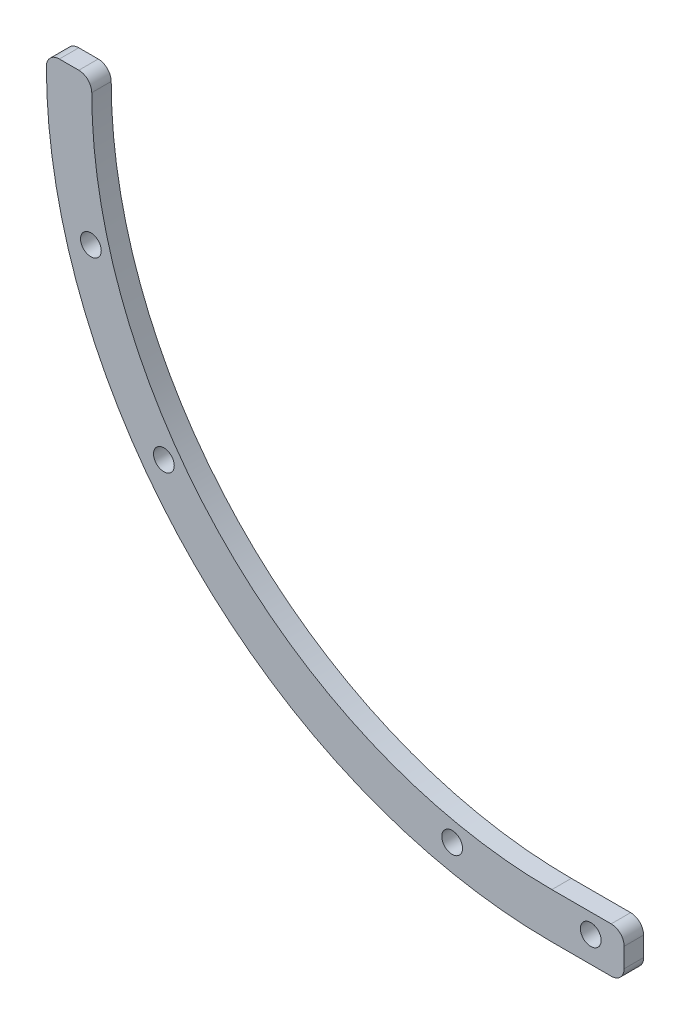
ISO-10303-21;
HEADER;
FILE_DESCRIPTION(('STEP AP214'),'2;1');
FILE_NAME('part.step','',(''),(''),'','','');
FILE_SCHEMA(('AUTOMOTIVE_DESIGN { 1 0 10303 214 1 1 1 1 }'));
ENDSEC;
DATA;
#1=APPLICATION_CONTEXT('core data for automotive mechanical design processes');
#2=APPLICATION_PROTOCOL_DEFINITION('international standard','automotive_design',2000,#1);
#3=PRODUCT_CONTEXT('',#1,'mechanical');
#4=PRODUCT('Part','Part','',(#3));
#5=PRODUCT_RELATED_PRODUCT_CATEGORY('part','',(#4));
#6=PRODUCT_DEFINITION_FORMATION('','',#4);
#7=PRODUCT_DEFINITION_CONTEXT('part definition',#1,'design');
#8=PRODUCT_DEFINITION('design','',#6,#7);
#9=PRODUCT_DEFINITION_SHAPE('','',#8);
#10=(LENGTH_UNIT() NAMED_UNIT(*) SI_UNIT(.MILLI.,.METRE.));
#11=(NAMED_UNIT(*) PLANE_ANGLE_UNIT() SI_UNIT($,.RADIAN.));
#12=(NAMED_UNIT(*) SI_UNIT($,.STERADIAN.) SOLID_ANGLE_UNIT());
#13=UNCERTAINTY_MEASURE_WITH_UNIT(LENGTH_MEASURE(1.E-05),#10,'distance_accuracy_value','');
#14=(GEOMETRIC_REPRESENTATION_CONTEXT(3) GLOBAL_UNCERTAINTY_ASSIGNED_CONTEXT((#13)) GLOBAL_UNIT_ASSIGNED_CONTEXT((#10,
#11,#12)) REPRESENTATION_CONTEXT('',''));
#15=CARTESIAN_POINT('',(0.,0.,0.));
#16=DIRECTION('',(0.,0.,1.));
#17=DIRECTION('',(1.,0.,0.));
#18=AXIS2_PLACEMENT_3D('',#15,#16,#17);
#19=CARTESIAN_POINT('',(-99.1545902943916,66.5,3.));
#20=DIRECTION('',(0.,0.,1.));
#21=DIRECTION('',(1.,0.,0.));
#22=AXIS2_PLACEMENT_3D('',#19,#20,#21);
#23=PLANE('',#22);
#24=DIRECTION('',(1.,0.,0.));
#25=VECTOR('',#24,1.);
#26=CARTESIAN_POINT('',(-177.154590294392,68.5,3.));
#27=LINE('',#26,#25);
#28=CARTESIAN_POINT('',(-175.154590294392,68.5,3.));
#29=VERTEX_POINT('',#28);
#30=CARTESIAN_POINT('',(-172.154590294392,68.5,3.));
#31=VERTEX_POINT('',#30);
#32=EDGE_CURVE('E173',#29,#31,#27,.T.);
#33=ORIENTED_EDGE('',*,*,#32,.F.);
#34=CARTESIAN_POINT('',(-175.154590294392,66.5,3.));
#35=DIRECTION('',(0.,0.,1.));
#36=DIRECTION('',(1.,0.,0.));
#37=AXIS2_PLACEMENT_3D('',#34,#35,#36);
#38=CIRCLE('',#37,2.);
#39=CARTESIAN_POINT('',(-177.154590294392,66.5,3.));
#40=VERTEX_POINT('',#39);
#41=EDGE_CURVE('E211',#29,#40,#38,.T.);
#42=ORIENTED_EDGE('',*,*,#41,.T.);
#43=CARTESIAN_POINT('',(-99.1545902943916,66.5,3.));
#44=DIRECTION('',(0.,0.,1.));
#45=DIRECTION('',(1.,0.,0.));
#46=AXIS2_PLACEMENT_3D('',#43,#44,#45);
#47=CIRCLE('',#46,78.);
#48=CARTESIAN_POINT('',(-99.1545902943917,-11.5,3.));
#49=VERTEX_POINT('',#48);
#50=EDGE_CURVE('E176',#40,#49,#47,.T.);
#51=ORIENTED_EDGE('',*,*,#50,.T.);
#52=DIRECTION('',(1.,0.,0.));
#53=VECTOR('',#52,1.);
#54=CARTESIAN_POINT('',(-99.1545902943917,-11.5,3.));
#55=LINE('',#54,#53);
#56=CARTESIAN_POINT('',(-90.,-11.5,3.));
#57=VERTEX_POINT('',#56);
#58=EDGE_CURVE('E178',#49,#57,#55,.T.);
#59=ORIENTED_EDGE('',*,*,#58,.T.);
#60=CARTESIAN_POINT('',(-90.,-9.50000000000001,3.));
#61=DIRECTION('',(0.,0.,1.));
#62=DIRECTION('',(1.,0.,0.));
#63=AXIS2_PLACEMENT_3D('',#60,#61,#62);
#64=CIRCLE('',#63,2.);
#65=CARTESIAN_POINT('',(-88.,-9.50000000000001,3.));
#66=VERTEX_POINT('',#65);
#67=EDGE_CURVE('E209',#57,#66,#64,.T.);
#68=ORIENTED_EDGE('',*,*,#67,.T.);
#69=DIRECTION('',(0.,1.,0.));
#70=VECTOR('',#69,1.);
#71=CARTESIAN_POINT('',(-88.,3.5,3.));
#72=LINE('',#71,#70);
#73=CARTESIAN_POINT('',(-88.,-6.5,3.));
#74=VERTEX_POINT('',#73);
#75=EDGE_CURVE('E182',#66,#74,#72,.T.);
#76=ORIENTED_EDGE('',*,*,#75,.T.);
#77=CARTESIAN_POINT('',(-90.,-6.5,3.));
#78=DIRECTION('',(0.,0.,1.));
#79=DIRECTION('',(1.,0.,0.));
#80=AXIS2_PLACEMENT_3D('',#77,#78,#79);
#81=CIRCLE('',#80,2.);
#82=CARTESIAN_POINT('',(-90.,-4.5,3.));
#83=VERTEX_POINT('',#82);
#84=EDGE_CURVE('E133',#74,#83,#81,.T.);
#85=ORIENTED_EDGE('',*,*,#84,.T.);
#86=DIRECTION('',(1.,0.,0.));
#87=VECTOR('',#86,1.);
#88=CARTESIAN_POINT('',(-88.,-4.5,3.));
#89=LINE('',#88,#87);
#90=CARTESIAN_POINT('',(-99.1545902943917,-4.50000000000002,3.));
#91=VERTEX_POINT('',#90);
#92=EDGE_CURVE('E146',#91,#83,#89,.T.);
#93=ORIENTED_EDGE('',*,*,#92,.F.);
#94=CARTESIAN_POINT('',(-99.1545902943916,66.5,3.));
#95=DIRECTION('',(0.,0.,1.));
#96=DIRECTION('',(1.,0.,0.));
#97=AXIS2_PLACEMENT_3D('',#94,#95,#96);
#98=CIRCLE('',#97,71.);
#99=CARTESIAN_POINT('',(-170.154590294392,66.5,3.));
#100=VERTEX_POINT('',#99);
#101=EDGE_CURVE('E141',#100,#91,#98,.T.);
#102=ORIENTED_EDGE('',*,*,#101,.F.);
#103=CARTESIAN_POINT('',(-172.154590294392,66.5,3.));
#104=DIRECTION('',(0.,0.,1.));
#105=DIRECTION('',(1.,0.,0.));
#106=AXIS2_PLACEMENT_3D('',#103,#104,#105);
#107=CIRCLE('',#106,2.);
#108=EDGE_CURVE('E124',#100,#31,#107,.T.);
#109=ORIENTED_EDGE('',*,*,#108,.T.);
#110=EDGE_LOOP('',(#33,#42,#51,#59,#68,#76,#85,#93,#102,#109));
#111=FACE_BOUND('',#110,.T.);
#112=CARTESIAN_POINT('',(-170.287955793827,46.102835669542,3.));
#113=DIRECTION('',(0.,0.,1.));
#114=DIRECTION('',(1.,0.,0.));
#115=AXIS2_PLACEMENT_3D('',#112,#113,#114);
#116=CIRCLE('',#115,1.59999999999999);
#117=CARTESIAN_POINT('',(-168.687955793827,46.102835669542,3.));
#118=VERTEX_POINT('',#117);
#119=EDGE_CURVE('E157',#118,#118,#116,.T.);
#120=ORIENTED_EDGE('',*,*,#119,.F.);
#121=EDGE_LOOP('',(#120));
#122=FACE_BOUND('',#121,.T.);
#123=CARTESIAN_POINT('',(-159.021847878138,23.0038913303573,3.));
#124=DIRECTION('',(0.,0.,1.));
#125=DIRECTION('',(1.,0.,0.));
#126=AXIS2_PLACEMENT_3D('',#123,#124,#125);
#127=CIRCLE('',#126,1.59999999999999);
#128=CARTESIAN_POINT('',(-157.421847878138,23.0038913303573,3.));
#129=VERTEX_POINT('',#128);
#130=EDGE_CURVE('E161',#129,#129,#127,.T.);
#131=ORIENTED_EDGE('',*,*,#130,.F.);
#132=EDGE_LOOP('',(#131));
#133=FACE_BOUND('',#132,.T.);
#134=CARTESIAN_POINT('',(-114.540055414905,-5.88292245430175,3.));
#135=DIRECTION('',(0.,0.,1.));
#136=DIRECTION('',(1.,0.,0.));
#137=AXIS2_PLACEMENT_3D('',#134,#135,#136);
#138=CIRCLE('',#137,1.60000000000001);
#139=CARTESIAN_POINT('',(-112.940055414905,-5.88292245430175,3.));
#140=VERTEX_POINT('',#139);
#141=EDGE_CURVE('E164',#140,#140,#138,.T.);
#142=ORIENTED_EDGE('',*,*,#141,.F.);
#143=EDGE_LOOP('',(#142));
#144=FACE_BOUND('',#143,.T.);
#145=CARTESIAN_POINT('',(-93.1545902943916,-7.50000000000001,3.));
#146=DIRECTION('',(0.,0.,1.));
#147=DIRECTION('',(1.,0.,0.));
#148=AXIS2_PLACEMENT_3D('',#145,#146,#147);
#149=CIRCLE('',#148,1.60000000000001);
#150=CARTESIAN_POINT('',(-91.5545902943916,-7.50000000000001,3.));
#151=VERTEX_POINT('',#150);
#152=EDGE_CURVE('E156',#151,#151,#149,.T.);
#153=ORIENTED_EDGE('',*,*,#152,.F.);
#154=EDGE_LOOP('',(#153));
#155=FACE_BOUND('',#154,.T.);
#156=ADVANCED_FACE('F47',(#111,#122,#133,#144,#155),#23,.T.);
#157=CARTESIAN_POINT('',(-99.1545902943916,66.5,0.));
#158=DIRECTION('',(0.,0.,1.));
#159=DIRECTION('',(1.,0.,0.));
#160=AXIS2_PLACEMENT_3D('',#157,#158,#159);
#161=PLANE('',#160);
#162=CARTESIAN_POINT('',(-170.287955793827,46.102835669542,0.));
#163=DIRECTION('',(0.,0.,1.));
#164=DIRECTION('',(1.,0.,0.));
#165=AXIS2_PLACEMENT_3D('',#162,#163,#164);
#166=CIRCLE('',#165,1.59999999999999);
#167=CARTESIAN_POINT('',(-168.687955793827,46.102835669542,0.));
#168=VERTEX_POINT('',#167);
#169=EDGE_CURVE('E175',#168,#168,#166,.T.);
#170=ORIENTED_EDGE('',*,*,#169,.T.);
#171=EDGE_LOOP('',(#170));
#172=FACE_BOUND('',#171,.T.);
#173=CARTESIAN_POINT('',(-159.021847878138,23.0038913303573,0.));
#174=DIRECTION('',(0.,0.,1.));
#175=DIRECTION('',(1.,0.,0.));
#176=AXIS2_PLACEMENT_3D('',#173,#174,#175);
#177=CIRCLE('',#176,1.59999999999999);
#178=CARTESIAN_POINT('',(-157.421847878138,23.0038913303573,0.));
#179=VERTEX_POINT('',#178);
#180=EDGE_CURVE('E199',#179,#179,#177,.T.);
#181=ORIENTED_EDGE('',*,*,#180,.T.);
#182=EDGE_LOOP('',(#181));
#183=FACE_BOUND('',#182,.T.);
#184=CARTESIAN_POINT('',(-114.540055414905,-5.88292245430175,0.));
#185=DIRECTION('',(0.,0.,1.));
#186=DIRECTION('',(1.,0.,0.));
#187=AXIS2_PLACEMENT_3D('',#184,#185,#186);
#188=CIRCLE('',#187,1.60000000000001);
#189=CARTESIAN_POINT('',(-112.940055414905,-5.88292245430175,0.));
#190=VERTEX_POINT('',#189);
#191=EDGE_CURVE('E196',#190,#190,#188,.T.);
#192=ORIENTED_EDGE('',*,*,#191,.T.);
#193=EDGE_LOOP('',(#192));
#194=FACE_BOUND('',#193,.T.);
#195=CARTESIAN_POINT('',(-93.1545902943916,-7.50000000000001,0.));
#196=DIRECTION('',(0.,0.,1.));
#197=DIRECTION('',(1.,0.,0.));
#198=AXIS2_PLACEMENT_3D('',#195,#196,#197);
#199=CIRCLE('',#198,1.60000000000001);
#200=CARTESIAN_POINT('',(-91.5545902943916,-7.50000000000001,0.));
#201=VERTEX_POINT('',#200);
#202=EDGE_CURVE('E160',#201,#201,#199,.T.);
#203=ORIENTED_EDGE('',*,*,#202,.T.);
#204=EDGE_LOOP('',(#203));
#205=FACE_BOUND('',#204,.T.);
#206=CARTESIAN_POINT('',(-99.1545902943916,66.5,0.));
#207=DIRECTION('',(0.,0.,1.));
#208=DIRECTION('',(1.,0.,0.));
#209=AXIS2_PLACEMENT_3D('',#206,#207,#208);
#210=CIRCLE('',#209,78.);
#211=CARTESIAN_POINT('',(-177.154590294392,66.5,0.));
#212=VERTEX_POINT('',#211);
#213=CARTESIAN_POINT('',(-99.1545902943917,-11.5,0.));
#214=VERTEX_POINT('',#213);
#215=EDGE_CURVE('E172',#212,#214,#210,.T.);
#216=ORIENTED_EDGE('',*,*,#215,.F.);
#217=CARTESIAN_POINT('',(-175.154590294392,66.5,0.));
#218=DIRECTION('',(0.,0.,1.));
#219=DIRECTION('',(1.,0.,0.));
#220=AXIS2_PLACEMENT_3D('',#217,#218,#219);
#221=CIRCLE('',#220,2.);
#222=CARTESIAN_POINT('',(-175.154590294392,68.5,0.));
#223=VERTEX_POINT('',#222);
#224=EDGE_CURVE('E217',#212,#223,#221,.F.);
#225=ORIENTED_EDGE('',*,*,#224,.T.);
#226=DIRECTION('',(1.,0.,0.));
#227=VECTOR('',#226,1.);
#228=CARTESIAN_POINT('',(-177.154590294392,68.5,0.));
#229=LINE('',#228,#227);
#230=CARTESIAN_POINT('',(-172.154590294392,68.5,0.));
#231=VERTEX_POINT('',#230);
#232=EDGE_CURVE('E169',#223,#231,#229,.T.);
#233=ORIENTED_EDGE('',*,*,#232,.T.);
#234=CARTESIAN_POINT('',(-172.154590294392,66.5,0.));
#235=DIRECTION('',(0.,0.,1.));
#236=DIRECTION('',(1.,0.,0.));
#237=AXIS2_PLACEMENT_3D('',#234,#235,#236);
#238=CIRCLE('',#237,2.);
#239=CARTESIAN_POINT('',(-170.154590294392,66.5,0.));
#240=VERTEX_POINT('',#239);
#241=EDGE_CURVE('E213',#231,#240,#238,.F.);
#242=ORIENTED_EDGE('',*,*,#241,.T.);
#243=CARTESIAN_POINT('',(-99.1545902943916,66.5,0.));
#244=DIRECTION('',(0.,0.,1.));
#245=DIRECTION('',(1.,0.,0.));
#246=AXIS2_PLACEMENT_3D('',#243,#244,#245);
#247=CIRCLE('',#246,71.);
#248=CARTESIAN_POINT('',(-99.1545902943917,-4.50000000000002,0.));
#249=VERTEX_POINT('',#248);
#250=EDGE_CURVE('E144',#240,#249,#247,.T.);
#251=ORIENTED_EDGE('',*,*,#250,.T.);
#252=DIRECTION('',(1.,0.,0.));
#253=VECTOR('',#252,1.);
#254=CARTESIAN_POINT('',(-99.1545902943916,-4.5,0.));
#255=LINE('',#254,#253);
#256=CARTESIAN_POINT('',(-90.,-4.5,0.));
#257=VERTEX_POINT('',#256);
#258=EDGE_CURVE('E153',#249,#257,#255,.T.);
#259=ORIENTED_EDGE('',*,*,#258,.T.);
#260=CARTESIAN_POINT('',(-90.,-6.5,0.));
#261=DIRECTION('',(0.,0.,1.));
#262=DIRECTION('',(1.,0.,0.));
#263=AXIS2_PLACEMENT_3D('',#260,#261,#262);
#264=CIRCLE('',#263,2.);
#265=CARTESIAN_POINT('',(-88.,-6.5,0.));
#266=VERTEX_POINT('',#265);
#267=EDGE_CURVE('E68',#257,#266,#264,.F.);
#268=ORIENTED_EDGE('',*,*,#267,.T.);
#269=DIRECTION('',(0.,1.,0.));
#270=VECTOR('',#269,1.);
#271=CARTESIAN_POINT('',(-88.,3.5,0.));
#272=LINE('',#271,#270);
#273=CARTESIAN_POINT('',(-88.,-9.50000000000001,0.));
#274=VERTEX_POINT('',#273);
#275=EDGE_CURVE('E179',#274,#266,#272,.T.);
#276=ORIENTED_EDGE('',*,*,#275,.F.);
#277=CARTESIAN_POINT('',(-90.,-9.50000000000001,0.));
#278=DIRECTION('',(0.,0.,1.));
#279=DIRECTION('',(1.,0.,0.));
#280=AXIS2_PLACEMENT_3D('',#277,#278,#279);
#281=CIRCLE('',#280,2.);
#282=CARTESIAN_POINT('',(-90.,-11.5,0.));
#283=VERTEX_POINT('',#282);
#284=EDGE_CURVE('E62',#274,#283,#281,.F.);
#285=ORIENTED_EDGE('',*,*,#284,.T.);
#286=DIRECTION('',(1.,0.,0.));
#287=VECTOR('',#286,1.);
#288=CARTESIAN_POINT('',(-99.1545902943917,-11.5,0.));
#289=LINE('',#288,#287);
#290=EDGE_CURVE('E187',#214,#283,#289,.T.);
#291=ORIENTED_EDGE('',*,*,#290,.F.);
#292=EDGE_LOOP('',(#216,#225,#233,#242,#251,#259,#268,#276,#285,#291));
#293=FACE_BOUND('',#292,.T.);
#294=ADVANCED_FACE('F239',(#172,#183,#194,#205,#293),#161,.F.);
#295=CARTESIAN_POINT('',(-99.1545902943916,66.5,3.));
#296=DIRECTION('',(0.,0.,-1.));
#297=DIRECTION('',(-1.,0.,0.));
#298=AXIS2_PLACEMENT_3D('',#295,#296,#297);
#299=CYLINDRICAL_SURFACE('',#298,78.);
#300=ORIENTED_EDGE('',*,*,#215,.T.);
#301=DIRECTION('',(0.,0.,-1.));
#302=VECTOR('',#301,1.);
#303=CARTESIAN_POINT('',(-99.1545902943917,-11.5,3.));
#304=LINE('',#303,#302);
#305=EDGE_CURVE('E185',#49,#214,#304,.T.);
#306=ORIENTED_EDGE('',*,*,#305,.F.);
#307=ORIENTED_EDGE('',*,*,#50,.F.);
#308=DIRECTION('',(0.,0.,-1.));
#309=VECTOR('',#308,1.);
#310=CARTESIAN_POINT('',(-177.154590294392,66.5,3.));
#311=LINE('',#310,#309);
#312=EDGE_CURVE('E192',#40,#212,#311,.T.);
#313=ORIENTED_EDGE('',*,*,#312,.T.);
#314=EDGE_LOOP('',(#300,#306,#307,#313));
#315=FACE_BOUND('',#314,.T.);
#316=ADVANCED_FACE('F242',(#315),#299,.T.);
#317=CARTESIAN_POINT('',(-99.1545902943917,-11.5,3.));
#318=DIRECTION('',(0.,1.,0.));
#319=DIRECTION('',(-1.,0.,0.));
#320=AXIS2_PLACEMENT_3D('',#317,#318,#319);
#321=PLANE('',#320);
#322=ORIENTED_EDGE('',*,*,#290,.T.);
#323=DIRECTION('',(0.,0.,-1.));
#324=VECTOR('',#323,1.);
#325=CARTESIAN_POINT('',(-90.,-11.5,3.));
#326=LINE('',#325,#324);
#327=EDGE_CURVE('E55',#283,#57,#326,.F.);
#328=ORIENTED_EDGE('',*,*,#327,.T.);
#329=ORIENTED_EDGE('',*,*,#58,.F.);
#330=ORIENTED_EDGE('',*,*,#305,.T.);
#331=EDGE_LOOP('',(#322,#328,#329,#330));
#332=FACE_BOUND('',#331,.T.);
#333=ADVANCED_FACE('F227',(#332),#321,.F.);
#334=CARTESIAN_POINT('',(-88.,3.5,3.));
#335=DIRECTION('',(-1.,0.,0.));
#336=DIRECTION('',(0.,0.,1.));
#337=AXIS2_PLACEMENT_3D('',#334,#335,#336);
#338=PLANE('',#337);
#339=ORIENTED_EDGE('',*,*,#75,.F.);
#340=DIRECTION('',(0.,0.,-1.));
#341=VECTOR('',#340,1.);
#342=CARTESIAN_POINT('',(-88.,-9.50000000000001,3.));
#343=LINE('',#342,#341);
#344=EDGE_CURVE('E222',#66,#274,#343,.T.);
#345=ORIENTED_EDGE('',*,*,#344,.T.);
#346=ORIENTED_EDGE('',*,*,#275,.T.);
#347=DIRECTION('',(0.,0.,1.));
#348=VECTOR('',#347,1.);
#349=CARTESIAN_POINT('',(-88.,-6.5,3.));
#350=LINE('',#349,#348);
#351=EDGE_CURVE('E219',#266,#74,#350,.T.);
#352=ORIENTED_EDGE('',*,*,#351,.T.);
#353=EDGE_LOOP('',(#339,#345,#346,#352));
#354=FACE_BOUND('',#353,.T.);
#355=ADVANCED_FACE('F236',(#354),#338,.F.);
#356=CARTESIAN_POINT('',(-177.154590294392,68.5,0.));
#357=DIRECTION('',(0.,-1.,0.));
#358=DIRECTION('',(0.,0.,-1.));
#359=AXIS2_PLACEMENT_3D('',#356,#357,#358);
#360=PLANE('',#359);
#361=ORIENTED_EDGE('',*,*,#232,.F.);
#362=DIRECTION('',(0.,0.,1.));
#363=VECTOR('',#362,1.);
#364=CARTESIAN_POINT('',(-175.154590294392,68.5,0.));
#365=LINE('',#364,#363);
#366=EDGE_CURVE('E134',#223,#29,#365,.T.);
#367=ORIENTED_EDGE('',*,*,#366,.T.);
#368=ORIENTED_EDGE('',*,*,#32,.T.);
#369=DIRECTION('',(0.,0.,1.));
#370=VECTOR('',#369,1.);
#371=CARTESIAN_POINT('',(-172.154590294392,68.5,0.));
#372=LINE('',#371,#370);
#373=EDGE_CURVE('E128',#31,#231,#372,.F.);
#374=ORIENTED_EDGE('',*,*,#373,.T.);
#375=EDGE_LOOP('',(#361,#367,#368,#374));
#376=FACE_BOUND('',#375,.T.);
#377=ADVANCED_FACE('F257',(#376),#360,.F.);
#378=CARTESIAN_POINT('',(-93.1545902943916,-7.50000000000001,-7.));
#379=DIRECTION('',(0.,0.,1.));
#380=DIRECTION('',(1.,0.,0.));
#381=AXIS2_PLACEMENT_3D('',#378,#379,#380);
#382=CYLINDRICAL_SURFACE('',#381,1.60000000000001);
#383=ORIENTED_EDGE('',*,*,#152,.T.);
#384=EDGE_LOOP('',(#383));
#385=FACE_BOUND('',#384,.T.);
#386=ORIENTED_EDGE('',*,*,#202,.F.);
#387=EDGE_LOOP('',(#386));
#388=FACE_BOUND('',#387,.T.);
#389=ADVANCED_FACE('F279',(#385,#388),#382,.F.);
#390=CARTESIAN_POINT('',(-114.540055414905,-5.88292245430175,-7.));
#391=DIRECTION('',(0.,0.,1.));
#392=DIRECTION('',(1.,0.,0.));
#393=AXIS2_PLACEMENT_3D('',#390,#391,#392);
#394=CYLINDRICAL_SURFACE('',#393,1.60000000000001);
#395=ORIENTED_EDGE('',*,*,#141,.T.);
#396=EDGE_LOOP('',(#395));
#397=FACE_BOUND('',#396,.T.);
#398=ORIENTED_EDGE('',*,*,#191,.F.);
#399=EDGE_LOOP('',(#398));
#400=FACE_BOUND('',#399,.T.);
#401=ADVANCED_FACE('F284',(#397,#400),#394,.F.);
#402=CARTESIAN_POINT('',(-159.021847878138,23.0038913303573,-7.));
#403=DIRECTION('',(0.,0.,1.));
#404=DIRECTION('',(1.,0.,0.));
#405=AXIS2_PLACEMENT_3D('',#402,#403,#404);
#406=CYLINDRICAL_SURFACE('',#405,1.59999999999999);
#407=ORIENTED_EDGE('',*,*,#130,.T.);
#408=EDGE_LOOP('',(#407));
#409=FACE_BOUND('',#408,.T.);
#410=ORIENTED_EDGE('',*,*,#180,.F.);
#411=EDGE_LOOP('',(#410));
#412=FACE_BOUND('',#411,.T.);
#413=ADVANCED_FACE('F290',(#409,#412),#406,.F.);
#414=CARTESIAN_POINT('',(-170.287955793827,46.102835669542,-7.));
#415=DIRECTION('',(0.,0.,1.));
#416=DIRECTION('',(1.,0.,0.));
#417=AXIS2_PLACEMENT_3D('',#414,#415,#416);
#418=CYLINDRICAL_SURFACE('',#417,1.59999999999999);
#419=ORIENTED_EDGE('',*,*,#119,.T.);
#420=EDGE_LOOP('',(#419));
#421=FACE_BOUND('',#420,.T.);
#422=ORIENTED_EDGE('',*,*,#169,.F.);
#423=EDGE_LOOP('',(#422));
#424=FACE_BOUND('',#423,.T.);
#425=ADVANCED_FACE('F294',(#421,#424),#418,.F.);
#426=CARTESIAN_POINT('',(-99.1545902943916,66.5,-7.));
#427=DIRECTION('',(0.,0.,1.));
#428=DIRECTION('',(1.,0.,0.));
#429=AXIS2_PLACEMENT_3D('',#426,#427,#428);
#430=CYLINDRICAL_SURFACE('',#429,71.);
#431=DIRECTION('',(0.,0.,1.));
#432=VECTOR('',#431,1.);
#433=CARTESIAN_POINT('',(-170.154590294392,66.5,-7.));
#434=LINE('',#433,#432);
#435=EDGE_CURVE('E127',#240,#100,#434,.T.);
#436=ORIENTED_EDGE('',*,*,#435,.T.);
#437=ORIENTED_EDGE('',*,*,#101,.T.);
#438=DIRECTION('',(0.,0.,1.));
#439=VECTOR('',#438,1.);
#440=CARTESIAN_POINT('',(-99.1545902943917,-4.50000000000002,-7.));
#441=LINE('',#440,#439);
#442=EDGE_CURVE('E145',#249,#91,#441,.T.);
#443=ORIENTED_EDGE('',*,*,#442,.F.);
#444=ORIENTED_EDGE('',*,*,#250,.F.);
#445=EDGE_LOOP('',(#436,#437,#443,#444));
#446=FACE_BOUND('',#445,.T.);
#447=ADVANCED_FACE('F139',(#446),#430,.F.);
#448=CARTESIAN_POINT('',(-88.,-4.5,-7.));
#449=DIRECTION('',(0.,-1.,0.));
#450=DIRECTION('',(0.,0.,-1.));
#451=AXIS2_PLACEMENT_3D('',#448,#449,#450);
#452=PLANE('',#451);
#453=ORIENTED_EDGE('',*,*,#92,.T.);
#454=DIRECTION('',(0.,0.,1.));
#455=VECTOR('',#454,1.);
#456=CARTESIAN_POINT('',(-90.,-4.5,-7.));
#457=LINE('',#456,#455);
#458=EDGE_CURVE('E11',#83,#257,#457,.F.);
#459=ORIENTED_EDGE('',*,*,#458,.T.);
#460=ORIENTED_EDGE('',*,*,#258,.F.);
#461=ORIENTED_EDGE('',*,*,#442,.T.);
#462=EDGE_LOOP('',(#453,#459,#460,#461));
#463=FACE_BOUND('',#462,.T.);
#464=ADVANCED_FACE('F263',(#463),#452,.F.);
#465=CARTESIAN_POINT('',(-175.154590294392,66.5,0.));
#466=DIRECTION('',(0.,0.,1.));
#467=DIRECTION('',(1.,0.,0.));
#468=AXIS2_PLACEMENT_3D('',#465,#466,#467);
#469=CYLINDRICAL_SURFACE('',#468,2.);
#470=ORIENTED_EDGE('',*,*,#224,.F.);
#471=ORIENTED_EDGE('',*,*,#312,.F.);
#472=ORIENTED_EDGE('',*,*,#41,.F.);
#473=ORIENTED_EDGE('',*,*,#366,.F.);
#474=EDGE_LOOP('',(#470,#471,#472,#473));
#475=FACE_BOUND('',#474,.T.);
#476=ADVANCED_FACE('F260',(#475),#469,.T.);
#477=CARTESIAN_POINT('',(-90.,-9.50000000000001,3.));
#478=DIRECTION('',(0.,0.,-1.));
#479=DIRECTION('',(-1.,0.,0.));
#480=AXIS2_PLACEMENT_3D('',#477,#478,#479);
#481=CYLINDRICAL_SURFACE('',#480,2.);
#482=ORIENTED_EDGE('',*,*,#67,.F.);
#483=ORIENTED_EDGE('',*,*,#327,.F.);
#484=ORIENTED_EDGE('',*,*,#284,.F.);
#485=ORIENTED_EDGE('',*,*,#344,.F.);
#486=EDGE_LOOP('',(#482,#483,#484,#485));
#487=FACE_BOUND('',#486,.T.);
#488=ADVANCED_FACE('F234',(#487),#481,.T.);
#489=CARTESIAN_POINT('',(-90.,-6.5,3.));
#490=DIRECTION('',(0.,0.,1.));
#491=DIRECTION('',(1.,0.,0.));
#492=AXIS2_PLACEMENT_3D('',#489,#490,#491);
#493=CYLINDRICAL_SURFACE('',#492,2.);
#494=ORIENTED_EDGE('',*,*,#267,.F.);
#495=ORIENTED_EDGE('',*,*,#458,.F.);
#496=ORIENTED_EDGE('',*,*,#84,.F.);
#497=ORIENTED_EDGE('',*,*,#351,.F.);
#498=EDGE_LOOP('',(#494,#495,#496,#497));
#499=FACE_BOUND('',#498,.T.);
#500=ADVANCED_FACE('F266',(#499),#493,.T.);
#501=CARTESIAN_POINT('',(-172.154590294392,66.5,-7.));
#502=DIRECTION('',(0.,0.,1.));
#503=DIRECTION('',(1.,0.,0.));
#504=AXIS2_PLACEMENT_3D('',#501,#502,#503);
#505=CYLINDRICAL_SURFACE('',#504,2.);
#506=ORIENTED_EDGE('',*,*,#241,.F.);
#507=ORIENTED_EDGE('',*,*,#373,.F.);
#508=ORIENTED_EDGE('',*,*,#108,.F.);
#509=ORIENTED_EDGE('',*,*,#435,.F.);
#510=EDGE_LOOP('',(#506,#507,#508,#509));
#511=FACE_BOUND('',#510,.T.);
#512=ADVANCED_FACE('F49',(#511),#505,.T.);
#513=CLOSED_SHELL('',(#156,#294,#316,#333,#355,#377,#389,#401,#413,#425,#447,#464,#476,#488,
#500,#512));
#514=MANIFOLD_SOLID_BREP('B2',#513);
#515=ADVANCED_BREP_SHAPE_REPRESENTATION('',(#18,#514),#14);
#516=SHAPE_DEFINITION_REPRESENTATION(#9,#515);
ENDSEC;
END-ISO-10303-21;
